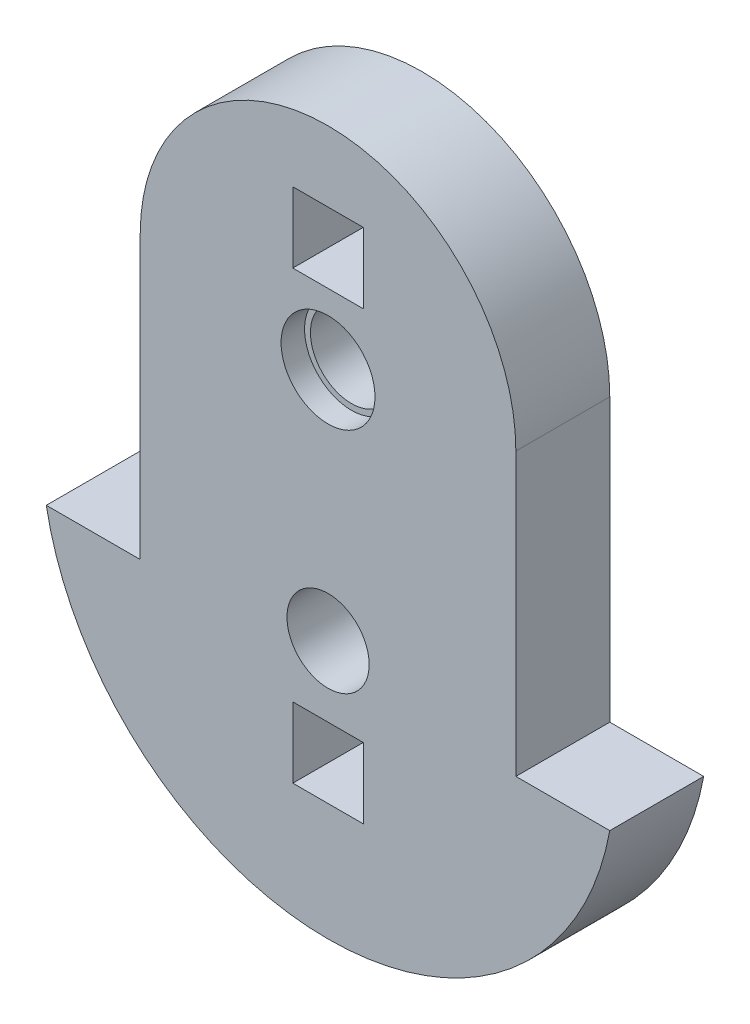
ISO-10303-21;
HEADER;
FILE_DESCRIPTION(('STEP AP214'),'2;1');
FILE_NAME('part.step','',(''),(''),'','','');
FILE_SCHEMA(('AUTOMOTIVE_DESIGN { 1 0 10303 214 1 1 1 1 }'));
ENDSEC;
DATA;
#1=APPLICATION_CONTEXT('core data for automotive mechanical design processes');
#2=APPLICATION_PROTOCOL_DEFINITION('international standard','automotive_design',2000,#1);
#3=PRODUCT_CONTEXT('',#1,'mechanical');
#4=PRODUCT('Part','Part','',(#3));
#5=PRODUCT_RELATED_PRODUCT_CATEGORY('part','',(#4));
#6=PRODUCT_DEFINITION_FORMATION('','',#4);
#7=PRODUCT_DEFINITION_CONTEXT('part definition',#1,'design');
#8=PRODUCT_DEFINITION('design','',#6,#7);
#9=PRODUCT_DEFINITION_SHAPE('','',#8);
#10=(LENGTH_UNIT() NAMED_UNIT(*) SI_UNIT(.MILLI.,.METRE.));
#11=(NAMED_UNIT(*) PLANE_ANGLE_UNIT() SI_UNIT($,.RADIAN.));
#12=(NAMED_UNIT(*) SI_UNIT($,.STERADIAN.) SOLID_ANGLE_UNIT());
#13=UNCERTAINTY_MEASURE_WITH_UNIT(LENGTH_MEASURE(1.E-05),#10,'distance_accuracy_value','');
#14=(GEOMETRIC_REPRESENTATION_CONTEXT(3) GLOBAL_UNCERTAINTY_ASSIGNED_CONTEXT((#13)) GLOBAL_UNIT_ASSIGNED_CONTEXT((#10,
#11,#12)) REPRESENTATION_CONTEXT('',''));
#15=CARTESIAN_POINT('',(0.,0.,0.));
#16=DIRECTION('',(0.,0.,1.));
#17=DIRECTION('',(1.,0.,0.));
#18=AXIS2_PLACEMENT_3D('',#15,#16,#17);
#19=CARTESIAN_POINT('',(0.,5.,4.));
#20=DIRECTION('',(0.,0.,-1.));
#21=DIRECTION('',(-1.,0.,0.));
#22=AXIS2_PLACEMENT_3D('',#19,#20,#21);
#23=CYLINDRICAL_SURFACE('',#22,1.75);
#24=CARTESIAN_POINT('',(0.,5.,0.));
#25=DIRECTION('',(0.,0.,1.));
#26=DIRECTION('',(1.,0.,0.));
#27=AXIS2_PLACEMENT_3D('',#24,#25,#26);
#28=CIRCLE('',#27,1.75);
#29=CARTESIAN_POINT('',(1.75,5.,0.));
#30=VERTEX_POINT('',#29);
#31=EDGE_CURVE('E217',#30,#30,#28,.T.);
#32=ORIENTED_EDGE('',*,*,#31,.F.);
#33=EDGE_LOOP('',(#32));
#34=FACE_BOUND('',#33,.T.);
#35=CARTESIAN_POINT('',(0.,5.,3.));
#36=DIRECTION('',(0.,0.,1.));
#37=DIRECTION('',(1.,0.,0.));
#38=AXIS2_PLACEMENT_3D('',#35,#36,#37);
#39=CIRCLE('',#38,1.75);
#40=CARTESIAN_POINT('',(1.75,5.,3.));
#41=VERTEX_POINT('',#40);
#42=EDGE_CURVE('E43',#41,#41,#39,.T.);
#43=ORIENTED_EDGE('',*,*,#42,.T.);
#44=EDGE_LOOP('',(#43));
#45=FACE_BOUND('',#44,.T.);
#46=ADVANCED_FACE('F39',(#34,#45),#23,.F.);
#47=CARTESIAN_POINT('',(0.,6.,4.));
#48=DIRECTION('',(0.,0.,-1.));
#49=DIRECTION('',(-1.,0.,0.));
#50=AXIS2_PLACEMENT_3D('',#47,#48,#49);
#51=PLANE('',#50);
#52=CARTESIAN_POINT('',(0.,5.,4.));
#53=DIRECTION('',(0.,0.,1.));
#54=DIRECTION('',(1.,0.,0.));
#55=AXIS2_PLACEMENT_3D('',#52,#53,#54);
#56=CIRCLE('',#55,2.);
#57=CARTESIAN_POINT('',(2.,5.,4.));
#58=VERTEX_POINT('',#57);
#59=EDGE_CURVE('E168',#58,#58,#56,.T.);
#60=ORIENTED_EDGE('',*,*,#59,.F.);
#61=EDGE_LOOP('',(#60));
#62=FACE_BOUND('',#61,.T.);
#63=DIRECTION('',(-1.,0.,0.));
#64=VECTOR('',#63,1.);
#65=CARTESIAN_POINT('',(-1.5,11.,4.));
#66=LINE('',#65,#64);
#67=CARTESIAN_POINT('',(1.5,11.,4.));
#68=VERTEX_POINT('',#67);
#69=CARTESIAN_POINT('',(-1.5,11.,4.));
#70=VERTEX_POINT('',#69);
#71=EDGE_CURVE('E174',#68,#70,#66,.T.);
#72=ORIENTED_EDGE('',*,*,#71,.F.);
#73=DIRECTION('',(0.,1.,0.));
#74=VECTOR('',#73,1.);
#75=CARTESIAN_POINT('',(1.5,8.,4.));
#76=LINE('',#75,#74);
#77=CARTESIAN_POINT('',(1.5,8.,4.));
#78=VERTEX_POINT('',#77);
#79=EDGE_CURVE('E55',#78,#68,#76,.T.);
#80=ORIENTED_EDGE('',*,*,#79,.F.);
#81=DIRECTION('',(1.,0.,0.));
#82=VECTOR('',#81,1.);
#83=CARTESIAN_POINT('',(-1.5,8.,4.));
#84=LINE('',#83,#82);
#85=CARTESIAN_POINT('',(-1.5,8.,4.));
#86=VERTEX_POINT('',#85);
#87=EDGE_CURVE('E162',#86,#78,#84,.T.);
#88=ORIENTED_EDGE('',*,*,#87,.F.);
#89=DIRECTION('',(0.,-1.,0.));
#90=VECTOR('',#89,1.);
#91=CARTESIAN_POINT('',(-1.5,8.,4.));
#92=LINE('',#91,#90);
#93=EDGE_CURVE('E165',#70,#86,#92,.T.);
#94=ORIENTED_EDGE('',*,*,#93,.F.);
#95=EDGE_LOOP('',(#72,#80,#88,#94));
#96=FACE_BOUND('',#95,.T.);
#97=DIRECTION('',(-1.,0.,0.));
#98=VECTOR('',#97,1.);
#99=CARTESIAN_POINT('',(-1.5,-8.,4.));
#100=LINE('',#99,#98);
#101=CARTESIAN_POINT('',(1.5,-8.,4.));
#102=VERTEX_POINT('',#101);
#103=CARTESIAN_POINT('',(-1.5,-8.,4.));
#104=VERTEX_POINT('',#103);
#105=EDGE_CURVE('E200',#102,#104,#100,.T.);
#106=ORIENTED_EDGE('',*,*,#105,.F.);
#107=DIRECTION('',(0.,1.,0.));
#108=VECTOR('',#107,1.);
#109=CARTESIAN_POINT('',(1.5,-11.,4.));
#110=LINE('',#109,#108);
#111=CARTESIAN_POINT('',(1.5,-11.,4.));
#112=VERTEX_POINT('',#111);
#113=EDGE_CURVE('E63',#112,#102,#110,.T.);
#114=ORIENTED_EDGE('',*,*,#113,.F.);
#115=DIRECTION('',(1.,0.,0.));
#116=VECTOR('',#115,1.);
#117=CARTESIAN_POINT('',(-1.5,-11.,4.));
#118=LINE('',#117,#116);
#119=CARTESIAN_POINT('',(-1.5,-11.,4.));
#120=VERTEX_POINT('',#119);
#121=EDGE_CURVE('E193',#120,#112,#118,.T.);
#122=ORIENTED_EDGE('',*,*,#121,.F.);
#123=DIRECTION('',(0.,-1.,0.));
#124=VECTOR('',#123,1.);
#125=CARTESIAN_POINT('',(-1.5,-11.,4.));
#126=LINE('',#125,#124);
#127=EDGE_CURVE('E196',#104,#120,#126,.T.);
#128=ORIENTED_EDGE('',*,*,#127,.F.);
#129=EDGE_LOOP('',(#106,#114,#122,#128));
#130=FACE_BOUND('',#129,.T.);
#131=CARTESIAN_POINT('',(0.,6.,4.));
#132=DIRECTION('',(0.,0.,1.));
#133=DIRECTION('',(-1.,0.,0.));
#134=AXIS2_PLACEMENT_3D('',#131,#132,#133);
#135=CIRCLE('',#134,8.);
#136=CARTESIAN_POINT('',(8.,6.,4.));
#137=VERTEX_POINT('',#136);
#138=CARTESIAN_POINT('',(-8.,6.,4.));
#139=VERTEX_POINT('',#138);
#140=EDGE_CURVE('E223',#137,#139,#135,.T.);
#141=ORIENTED_EDGE('',*,*,#140,.T.);
#142=DIRECTION('',(0.,-1.,0.));
#143=VECTOR('',#142,1.);
#144=CARTESIAN_POINT('',(-8.,6.,4.));
#145=LINE('',#144,#143);
#146=CARTESIAN_POINT('',(-8.,-6.,4.));
#147=VERTEX_POINT('',#146);
#148=EDGE_CURVE('E226',#139,#147,#145,.T.);
#149=ORIENTED_EDGE('',*,*,#148,.T.);
#150=DIRECTION('',(-1.,0.,0.));
#151=VECTOR('',#150,1.);
#152=CARTESIAN_POINT('',(-8.,-6.,4.));
#153=LINE('',#152,#151);
#154=CARTESIAN_POINT('',(-12.,-6.,4.));
#155=VERTEX_POINT('',#154);
#156=EDGE_CURVE('E229',#147,#155,#153,.T.);
#157=ORIENTED_EDGE('',*,*,#156,.T.);
#158=CARTESIAN_POINT('',(0.,-3.8,4.));
#159=DIRECTION('',(0.,0.,1.));
#160=DIRECTION('',(1.,0.,0.));
#161=AXIS2_PLACEMENT_3D('',#158,#159,#160);
#162=CIRCLE('',#161,12.2);
#163=CARTESIAN_POINT('',(12.,-6.,4.));
#164=VERTEX_POINT('',#163);
#165=EDGE_CURVE('E231',#155,#164,#162,.T.);
#166=ORIENTED_EDGE('',*,*,#165,.T.);
#167=DIRECTION('',(-1.,0.,0.));
#168=VECTOR('',#167,1.);
#169=CARTESIAN_POINT('',(8.,-6.,4.));
#170=LINE('',#169,#168);
#171=CARTESIAN_POINT('',(8.,-6.,4.));
#172=VERTEX_POINT('',#171);
#173=EDGE_CURVE('E233',#164,#172,#170,.T.);
#174=ORIENTED_EDGE('',*,*,#173,.T.);
#175=DIRECTION('',(0.,1.,0.));
#176=VECTOR('',#175,1.);
#177=CARTESIAN_POINT('',(8.,6.,4.));
#178=LINE('',#177,#176);
#179=EDGE_CURVE('E235',#172,#137,#178,.T.);
#180=ORIENTED_EDGE('',*,*,#179,.T.);
#181=EDGE_LOOP('',(#141,#149,#157,#166,#174,#180));
#182=FACE_BOUND('',#181,.T.);
#183=CARTESIAN_POINT('',(0.,-5.,4.));
#184=DIRECTION('',(0.,0.,1.));
#185=DIRECTION('',(1.,0.,0.));
#186=AXIS2_PLACEMENT_3D('',#183,#184,#185);
#187=CIRCLE('',#186,1.75);
#188=CARTESIAN_POINT('',(1.75,-5.,4.));
#189=VERTEX_POINT('',#188);
#190=EDGE_CURVE('E214',#189,#189,#187,.T.);
#191=ORIENTED_EDGE('',*,*,#190,.F.);
#192=EDGE_LOOP('',(#191));
#193=FACE_BOUND('',#192,.T.);
#194=ADVANCED_FACE('F284',(#62,#96,#130,#182,#193),#51,.F.);
#195=CARTESIAN_POINT('',(0.,6.,0.));
#196=DIRECTION('',(0.,0.,-1.));
#197=DIRECTION('',(-1.,0.,0.));
#198=AXIS2_PLACEMENT_3D('',#195,#196,#197);
#199=PLANE('',#198);
#200=DIRECTION('',(0.,1.,0.));
#201=VECTOR('',#200,1.);
#202=CARTESIAN_POINT('',(1.5,8.,0.));
#203=LINE('',#202,#201);
#204=CARTESIAN_POINT('',(1.5,8.,0.));
#205=VERTEX_POINT('',#204);
#206=CARTESIAN_POINT('',(1.5,11.,0.));
#207=VERTEX_POINT('',#206);
#208=EDGE_CURVE('E143',#205,#207,#203,.T.);
#209=ORIENTED_EDGE('',*,*,#208,.T.);
#210=DIRECTION('',(-1.,0.,0.));
#211=VECTOR('',#210,1.);
#212=CARTESIAN_POINT('',(-1.5,11.,0.));
#213=LINE('',#212,#211);
#214=CARTESIAN_POINT('',(-1.5,11.,0.));
#215=VERTEX_POINT('',#214);
#216=EDGE_CURVE('E153',#207,#215,#213,.T.);
#217=ORIENTED_EDGE('',*,*,#216,.T.);
#218=DIRECTION('',(0.,-1.,0.));
#219=VECTOR('',#218,1.);
#220=CARTESIAN_POINT('',(-1.5,8.,0.));
#221=LINE('',#220,#219);
#222=CARTESIAN_POINT('',(-1.5,8.,0.));
#223=VERTEX_POINT('',#222);
#224=EDGE_CURVE('E157',#215,#223,#221,.T.);
#225=ORIENTED_EDGE('',*,*,#224,.T.);
#226=DIRECTION('',(1.,0.,0.));
#227=VECTOR('',#226,1.);
#228=CARTESIAN_POINT('',(-1.5,8.,0.));
#229=LINE('',#228,#227);
#230=EDGE_CURVE('E149',#223,#205,#229,.T.);
#231=ORIENTED_EDGE('',*,*,#230,.T.);
#232=EDGE_LOOP('',(#209,#217,#225,#231));
#233=FACE_BOUND('',#232,.T.);
#234=DIRECTION('',(0.,1.,0.));
#235=VECTOR('',#234,1.);
#236=CARTESIAN_POINT('',(1.5,-11.,0.));
#237=LINE('',#236,#235);
#238=CARTESIAN_POINT('',(1.5,-11.,0.));
#239=VERTEX_POINT('',#238);
#240=CARTESIAN_POINT('',(1.5,-8.,0.));
#241=VERTEX_POINT('',#240);
#242=EDGE_CURVE('E197',#239,#241,#237,.T.);
#243=ORIENTED_EDGE('',*,*,#242,.T.);
#244=DIRECTION('',(-1.,0.,0.));
#245=VECTOR('',#244,1.);
#246=CARTESIAN_POINT('',(-1.5,-8.,0.));
#247=LINE('',#246,#245);
#248=CARTESIAN_POINT('',(-1.5,-8.,0.));
#249=VERTEX_POINT('',#248);
#250=EDGE_CURVE('E209',#241,#249,#247,.T.);
#251=ORIENTED_EDGE('',*,*,#250,.T.);
#252=DIRECTION('',(0.,-1.,0.));
#253=VECTOR('',#252,1.);
#254=CARTESIAN_POINT('',(-1.5,-11.,0.));
#255=LINE('',#254,#253);
#256=CARTESIAN_POINT('',(-1.5,-11.,0.));
#257=VERTEX_POINT('',#256);
#258=EDGE_CURVE('E206',#249,#257,#255,.T.);
#259=ORIENTED_EDGE('',*,*,#258,.T.);
#260=DIRECTION('',(1.,0.,0.));
#261=VECTOR('',#260,1.);
#262=CARTESIAN_POINT('',(-1.5,-11.,0.));
#263=LINE('',#262,#261);
#264=EDGE_CURVE('E186',#257,#239,#263,.T.);
#265=ORIENTED_EDGE('',*,*,#264,.T.);
#266=EDGE_LOOP('',(#243,#251,#259,#265));
#267=FACE_BOUND('',#266,.T.);
#268=ORIENTED_EDGE('',*,*,#31,.T.);
#269=EDGE_LOOP('',(#268));
#270=FACE_BOUND('',#269,.T.);
#271=CARTESIAN_POINT('',(0.,6.,0.));
#272=DIRECTION('',(0.,0.,1.));
#273=DIRECTION('',(-1.,0.,0.));
#274=AXIS2_PLACEMENT_3D('',#271,#272,#273);
#275=CIRCLE('',#274,8.);
#276=CARTESIAN_POINT('',(8.,6.,0.));
#277=VERTEX_POINT('',#276);
#278=CARTESIAN_POINT('',(-8.,6.,0.));
#279=VERTEX_POINT('',#278);
#280=EDGE_CURVE('E222',#277,#279,#275,.T.);
#281=ORIENTED_EDGE('',*,*,#280,.F.);
#282=DIRECTION('',(0.,1.,0.));
#283=VECTOR('',#282,1.);
#284=CARTESIAN_POINT('',(8.,6.,0.));
#285=LINE('',#284,#283);
#286=CARTESIAN_POINT('',(8.,-6.,0.));
#287=VERTEX_POINT('',#286);
#288=EDGE_CURVE('E227',#287,#277,#285,.T.);
#289=ORIENTED_EDGE('',*,*,#288,.F.);
#290=DIRECTION('',(-1.,0.,0.));
#291=VECTOR('',#290,1.);
#292=CARTESIAN_POINT('',(8.,-6.,0.));
#293=LINE('',#292,#291);
#294=CARTESIAN_POINT('',(12.,-6.,0.));
#295=VERTEX_POINT('',#294);
#296=EDGE_CURVE('E246',#295,#287,#293,.T.);
#297=ORIENTED_EDGE('',*,*,#296,.F.);
#298=CARTESIAN_POINT('',(0.,-3.8,0.));
#299=DIRECTION('',(0.,0.,1.));
#300=DIRECTION('',(1.,0.,0.));
#301=AXIS2_PLACEMENT_3D('',#298,#299,#300);
#302=CIRCLE('',#301,12.2);
#303=CARTESIAN_POINT('',(-12.,-6.,0.));
#304=VERTEX_POINT('',#303);
#305=EDGE_CURVE('E244',#304,#295,#302,.T.);
#306=ORIENTED_EDGE('',*,*,#305,.F.);
#307=DIRECTION('',(-1.,0.,0.));
#308=VECTOR('',#307,1.);
#309=CARTESIAN_POINT('',(-8.,-6.,0.));
#310=LINE('',#309,#308);
#311=CARTESIAN_POINT('',(-8.,-6.,0.));
#312=VERTEX_POINT('',#311);
#313=EDGE_CURVE('E242',#312,#304,#310,.T.);
#314=ORIENTED_EDGE('',*,*,#313,.F.);
#315=DIRECTION('',(0.,-1.,0.));
#316=VECTOR('',#315,1.);
#317=CARTESIAN_POINT('',(-8.,6.,0.));
#318=LINE('',#317,#316);
#319=EDGE_CURVE('E240',#279,#312,#318,.T.);
#320=ORIENTED_EDGE('',*,*,#319,.F.);
#321=EDGE_LOOP('',(#281,#289,#297,#306,#314,#320));
#322=FACE_BOUND('',#321,.T.);
#323=CARTESIAN_POINT('',(0.,-5.,0.));
#324=DIRECTION('',(0.,0.,1.));
#325=DIRECTION('',(1.,0.,0.));
#326=AXIS2_PLACEMENT_3D('',#323,#324,#325);
#327=CIRCLE('',#326,1.75);
#328=CARTESIAN_POINT('',(1.75,-5.,0.));
#329=VERTEX_POINT('',#328);
#330=EDGE_CURVE('E180',#329,#329,#327,.T.);
#331=ORIENTED_EDGE('',*,*,#330,.T.);
#332=EDGE_LOOP('',(#331));
#333=FACE_BOUND('',#332,.T.);
#334=ADVANCED_FACE('F159',(#233,#267,#270,#322,#333),#199,.T.);
#335=CARTESIAN_POINT('',(0.,6.,4.));
#336=DIRECTION('',(0.,0.,-1.));
#337=DIRECTION('',(-1.,0.,0.));
#338=AXIS2_PLACEMENT_3D('',#335,#336,#337);
#339=CYLINDRICAL_SURFACE('',#338,8.);
#340=ORIENTED_EDGE('',*,*,#280,.T.);
#341=DIRECTION('',(0.,0.,-1.));
#342=VECTOR('',#341,1.);
#343=CARTESIAN_POINT('',(-8.,6.,4.));
#344=LINE('',#343,#342);
#345=EDGE_CURVE('E11',#139,#279,#344,.T.);
#346=ORIENTED_EDGE('',*,*,#345,.F.);
#347=ORIENTED_EDGE('',*,*,#140,.F.);
#348=DIRECTION('',(0.,0.,-1.));
#349=VECTOR('',#348,1.);
#350=CARTESIAN_POINT('',(8.,6.,4.));
#351=LINE('',#350,#349);
#352=EDGE_CURVE('E237',#137,#277,#351,.T.);
#353=ORIENTED_EDGE('',*,*,#352,.T.);
#354=EDGE_LOOP('',(#340,#346,#347,#353));
#355=FACE_BOUND('',#354,.T.);
#356=ADVANCED_FACE('F41',(#355),#339,.T.);
#357=CARTESIAN_POINT('',(-8.,6.,4.));
#358=DIRECTION('',(1.,0.,0.));
#359=DIRECTION('',(0.,0.,-1.));
#360=AXIS2_PLACEMENT_3D('',#357,#358,#359);
#361=PLANE('',#360);
#362=ORIENTED_EDGE('',*,*,#319,.T.);
#363=DIRECTION('',(0.,0.,-1.));
#364=VECTOR('',#363,1.);
#365=CARTESIAN_POINT('',(-8.,-6.,4.));
#366=LINE('',#365,#364);
#367=EDGE_CURVE('E48',#147,#312,#366,.T.);
#368=ORIENTED_EDGE('',*,*,#367,.F.);
#369=ORIENTED_EDGE('',*,*,#148,.F.);
#370=ORIENTED_EDGE('',*,*,#345,.T.);
#371=EDGE_LOOP('',(#362,#368,#369,#370));
#372=FACE_BOUND('',#371,.T.);
#373=ADVANCED_FACE('F289',(#372),#361,.F.);
#374=CARTESIAN_POINT('',(-8.,-6.,4.));
#375=DIRECTION('',(0.,-1.,0.));
#376=DIRECTION('',(1.,0.,0.));
#377=AXIS2_PLACEMENT_3D('',#374,#375,#376);
#378=PLANE('',#377);
#379=ORIENTED_EDGE('',*,*,#313,.T.);
#380=DIRECTION('',(0.,0.,-1.));
#381=VECTOR('',#380,1.);
#382=CARTESIAN_POINT('',(-12.,-6.,4.));
#383=LINE('',#382,#381);
#384=EDGE_CURVE('E257',#155,#304,#383,.T.);
#385=ORIENTED_EDGE('',*,*,#384,.F.);
#386=ORIENTED_EDGE('',*,*,#156,.F.);
#387=ORIENTED_EDGE('',*,*,#367,.T.);
#388=EDGE_LOOP('',(#379,#385,#386,#387));
#389=FACE_BOUND('',#388,.T.);
#390=ADVANCED_FACE('F265',(#389),#378,.F.);
#391=CARTESIAN_POINT('',(0.,-3.8,4.));
#392=DIRECTION('',(0.,0.,-1.));
#393=DIRECTION('',(-1.,0.,0.));
#394=AXIS2_PLACEMENT_3D('',#391,#392,#393);
#395=CYLINDRICAL_SURFACE('',#394,12.2);
#396=ORIENTED_EDGE('',*,*,#305,.T.);
#397=DIRECTION('',(0.,0.,-1.));
#398=VECTOR('',#397,1.);
#399=CARTESIAN_POINT('',(12.,-6.,4.));
#400=LINE('',#399,#398);
#401=EDGE_CURVE('E254',#164,#295,#400,.T.);
#402=ORIENTED_EDGE('',*,*,#401,.F.);
#403=ORIENTED_EDGE('',*,*,#165,.F.);
#404=ORIENTED_EDGE('',*,*,#384,.T.);
#405=EDGE_LOOP('',(#396,#402,#403,#404));
#406=FACE_BOUND('',#405,.T.);
#407=ADVANCED_FACE('F276',(#406),#395,.T.);
#408=CARTESIAN_POINT('',(8.,-6.,4.));
#409=DIRECTION('',(0.,-1.,0.));
#410=DIRECTION('',(1.,0.,0.));
#411=AXIS2_PLACEMENT_3D('',#408,#409,#410);
#412=PLANE('',#411);
#413=ORIENTED_EDGE('',*,*,#296,.T.);
#414=DIRECTION('',(0.,0.,-1.));
#415=VECTOR('',#414,1.);
#416=CARTESIAN_POINT('',(8.,-6.,4.));
#417=LINE('',#416,#415);
#418=EDGE_CURVE('E251',#172,#287,#417,.T.);
#419=ORIENTED_EDGE('',*,*,#418,.F.);
#420=ORIENTED_EDGE('',*,*,#173,.F.);
#421=ORIENTED_EDGE('',*,*,#401,.T.);
#422=EDGE_LOOP('',(#413,#419,#420,#421));
#423=FACE_BOUND('',#422,.T.);
#424=ADVANCED_FACE('F280',(#423),#412,.F.);
#425=CARTESIAN_POINT('',(8.,6.,4.));
#426=DIRECTION('',(-1.,0.,0.));
#427=DIRECTION('',(0.,0.,1.));
#428=AXIS2_PLACEMENT_3D('',#425,#426,#427);
#429=PLANE('',#428);
#430=ORIENTED_EDGE('',*,*,#288,.T.);
#431=ORIENTED_EDGE('',*,*,#352,.F.);
#432=ORIENTED_EDGE('',*,*,#179,.F.);
#433=ORIENTED_EDGE('',*,*,#418,.T.);
#434=EDGE_LOOP('',(#430,#431,#432,#433));
#435=FACE_BOUND('',#434,.T.);
#436=ADVANCED_FACE('F292',(#435),#429,.F.);
#437=CARTESIAN_POINT('',(0.,-5.,4.));
#438=DIRECTION('',(0.,0.,-1.));
#439=DIRECTION('',(-1.,0.,0.));
#440=AXIS2_PLACEMENT_3D('',#437,#438,#439);
#441=CYLINDRICAL_SURFACE('',#440,1.75);
#442=ORIENTED_EDGE('',*,*,#190,.T.);
#443=EDGE_LOOP('',(#442));
#444=FACE_BOUND('',#443,.T.);
#445=ORIENTED_EDGE('',*,*,#330,.F.);
#446=EDGE_LOOP('',(#445));
#447=FACE_BOUND('',#446,.T.);
#448=ADVANCED_FACE('F294',(#444,#447),#441,.F.);
#449=CARTESIAN_POINT('',(1.5,-11.,0.));
#450=DIRECTION('',(1.,0.,0.));
#451=DIRECTION('',(0.,0.,-1.));
#452=AXIS2_PLACEMENT_3D('',#449,#450,#451);
#453=PLANE('',#452);
#454=ORIENTED_EDGE('',*,*,#113,.T.);
#455=DIRECTION('',(0.,0.,1.));
#456=VECTOR('',#455,1.);
#457=CARTESIAN_POINT('',(1.5,-8.,0.));
#458=LINE('',#457,#456);
#459=EDGE_CURVE('E184',#241,#102,#458,.T.);
#460=ORIENTED_EDGE('',*,*,#459,.F.);
#461=ORIENTED_EDGE('',*,*,#242,.F.);
#462=DIRECTION('',(0.,0.,1.));
#463=VECTOR('',#462,1.);
#464=CARTESIAN_POINT('',(1.5,-11.,0.));
#465=LINE('',#464,#463);
#466=EDGE_CURVE('E191',#239,#112,#465,.T.);
#467=ORIENTED_EDGE('',*,*,#466,.T.);
#468=EDGE_LOOP('',(#454,#460,#461,#467));
#469=FACE_BOUND('',#468,.T.);
#470=ADVANCED_FACE('F300',(#469),#453,.F.);
#471=CARTESIAN_POINT('',(-1.5,-11.,0.));
#472=DIRECTION('',(0.,-1.,0.));
#473=DIRECTION('',(0.,0.,-1.));
#474=AXIS2_PLACEMENT_3D('',#471,#472,#473);
#475=PLANE('',#474);
#476=ORIENTED_EDGE('',*,*,#121,.T.);
#477=ORIENTED_EDGE('',*,*,#466,.F.);
#478=ORIENTED_EDGE('',*,*,#264,.F.);
#479=DIRECTION('',(0.,0.,1.));
#480=VECTOR('',#479,1.);
#481=CARTESIAN_POINT('',(-1.5,-11.,0.));
#482=LINE('',#481,#480);
#483=EDGE_CURVE('E189',#257,#120,#482,.T.);
#484=ORIENTED_EDGE('',*,*,#483,.T.);
#485=EDGE_LOOP('',(#476,#477,#478,#484));
#486=FACE_BOUND('',#485,.T.);
#487=ADVANCED_FACE('F359',(#486),#475,.F.);
#488=CARTESIAN_POINT('',(-1.5,-11.,0.));
#489=DIRECTION('',(-1.,0.,0.));
#490=DIRECTION('',(0.,0.,1.));
#491=AXIS2_PLACEMENT_3D('',#488,#489,#490);
#492=PLANE('',#491);
#493=ORIENTED_EDGE('',*,*,#127,.T.);
#494=ORIENTED_EDGE('',*,*,#483,.F.);
#495=ORIENTED_EDGE('',*,*,#258,.F.);
#496=DIRECTION('',(0.,0.,1.));
#497=VECTOR('',#496,1.);
#498=CARTESIAN_POINT('',(-1.5,-8.,0.));
#499=LINE('',#498,#497);
#500=EDGE_CURVE('E187',#249,#104,#499,.T.);
#501=ORIENTED_EDGE('',*,*,#500,.T.);
#502=EDGE_LOOP('',(#493,#494,#495,#501));
#503=FACE_BOUND('',#502,.T.);
#504=ADVANCED_FACE('F368',(#503),#492,.F.);
#505=CARTESIAN_POINT('',(-1.5,-8.,0.));
#506=DIRECTION('',(0.,1.,0.));
#507=DIRECTION('',(0.,0.,1.));
#508=AXIS2_PLACEMENT_3D('',#505,#506,#507);
#509=PLANE('',#508);
#510=ORIENTED_EDGE('',*,*,#105,.T.);
#511=ORIENTED_EDGE('',*,*,#500,.F.);
#512=ORIENTED_EDGE('',*,*,#250,.F.);
#513=ORIENTED_EDGE('',*,*,#459,.T.);
#514=EDGE_LOOP('',(#510,#511,#512,#513));
#515=FACE_BOUND('',#514,.T.);
#516=ADVANCED_FACE('F377',(#515),#509,.F.);
#517=CARTESIAN_POINT('',(1.5,8.,0.));
#518=DIRECTION('',(1.,0.,0.));
#519=DIRECTION('',(0.,0.,-1.));
#520=AXIS2_PLACEMENT_3D('',#517,#518,#519);
#521=PLANE('',#520);
#522=ORIENTED_EDGE('',*,*,#79,.T.);
#523=DIRECTION('',(0.,0.,1.));
#524=VECTOR('',#523,1.);
#525=CARTESIAN_POINT('',(1.5,11.,0.));
#526=LINE('',#525,#524);
#527=EDGE_CURVE('E139',#207,#68,#526,.T.);
#528=ORIENTED_EDGE('',*,*,#527,.F.);
#529=ORIENTED_EDGE('',*,*,#208,.F.);
#530=DIRECTION('',(0.,0.,1.));
#531=VECTOR('',#530,1.);
#532=CARTESIAN_POINT('',(1.5,8.,0.));
#533=LINE('',#532,#531);
#534=EDGE_CURVE('E178',#205,#78,#533,.T.);
#535=ORIENTED_EDGE('',*,*,#534,.T.);
#536=EDGE_LOOP('',(#522,#528,#529,#535));
#537=FACE_BOUND('',#536,.T.);
#538=ADVANCED_FACE('F141',(#537),#521,.F.);
#539=CARTESIAN_POINT('',(-1.5,8.,0.));
#540=DIRECTION('',(0.,-1.,0.));
#541=DIRECTION('',(0.,0.,-1.));
#542=AXIS2_PLACEMENT_3D('',#539,#540,#541);
#543=PLANE('',#542);
#544=ORIENTED_EDGE('',*,*,#87,.T.);
#545=ORIENTED_EDGE('',*,*,#534,.F.);
#546=ORIENTED_EDGE('',*,*,#230,.F.);
#547=DIRECTION('',(0.,0.,1.));
#548=VECTOR('',#547,1.);
#549=CARTESIAN_POINT('',(-1.5,8.,0.));
#550=LINE('',#549,#548);
#551=EDGE_CURVE('E181',#223,#86,#550,.T.);
#552=ORIENTED_EDGE('',*,*,#551,.T.);
#553=EDGE_LOOP('',(#544,#545,#546,#552));
#554=FACE_BOUND('',#553,.T.);
#555=ADVANCED_FACE('F396',(#554),#543,.F.);
#556=CARTESIAN_POINT('',(-1.5,8.,0.));
#557=DIRECTION('',(-1.,0.,0.));
#558=DIRECTION('',(0.,0.,1.));
#559=AXIS2_PLACEMENT_3D('',#556,#557,#558);
#560=PLANE('',#559);
#561=ORIENTED_EDGE('',*,*,#93,.T.);
#562=ORIENTED_EDGE('',*,*,#551,.F.);
#563=ORIENTED_EDGE('',*,*,#224,.F.);
#564=DIRECTION('',(0.,0.,1.));
#565=VECTOR('',#564,1.);
#566=CARTESIAN_POINT('',(-1.5,11.,0.));
#567=LINE('',#566,#565);
#568=EDGE_CURVE('E148',#215,#70,#567,.T.);
#569=ORIENTED_EDGE('',*,*,#568,.T.);
#570=EDGE_LOOP('',(#561,#562,#563,#569));
#571=FACE_BOUND('',#570,.T.);
#572=ADVANCED_FACE('F405',(#571),#560,.F.);
#573=CARTESIAN_POINT('',(-1.5,11.,0.));
#574=DIRECTION('',(0.,1.,0.));
#575=DIRECTION('',(0.,0.,1.));
#576=AXIS2_PLACEMENT_3D('',#573,#574,#575);
#577=PLANE('',#576);
#578=ORIENTED_EDGE('',*,*,#71,.T.);
#579=ORIENTED_EDGE('',*,*,#568,.F.);
#580=ORIENTED_EDGE('',*,*,#216,.F.);
#581=ORIENTED_EDGE('',*,*,#527,.T.);
#582=EDGE_LOOP('',(#578,#579,#580,#581));
#583=FACE_BOUND('',#582,.T.);
#584=ADVANCED_FACE('F154',(#583),#577,.F.);
#585=CARTESIAN_POINT('',(0.,5.,3.));
#586=DIRECTION('',(0.,0.,1.));
#587=DIRECTION('',(1.,0.,0.));
#588=AXIS2_PLACEMENT_3D('',#585,#586,#587);
#589=CYLINDRICAL_SURFACE('',#588,2.);
#590=CARTESIAN_POINT('',(0.,5.,3.));
#591=DIRECTION('',(0.,0.,1.));
#592=DIRECTION('',(1.,0.,0.));
#593=AXIS2_PLACEMENT_3D('',#590,#591,#592);
#594=CIRCLE('',#593,2.);
#595=CARTESIAN_POINT('',(2.,5.,3.));
#596=VERTEX_POINT('',#595);
#597=EDGE_CURVE('E454',#596,#596,#594,.T.);
#598=ORIENTED_EDGE('',*,*,#597,.F.);
#599=EDGE_LOOP('',(#598));
#600=FACE_BOUND('',#599,.T.);
#601=ORIENTED_EDGE('',*,*,#59,.T.);
#602=EDGE_LOOP('',(#601));
#603=FACE_BOUND('',#602,.T.);
#604=ADVANCED_FACE('F423',(#600,#603),#589,.F.);
#605=CARTESIAN_POINT('',(0.,5.,3.));
#606=DIRECTION('',(0.,0.,1.));
#607=DIRECTION('',(1.,0.,0.));
#608=AXIS2_PLACEMENT_3D('',#605,#606,#607);
#609=PLANE('',#608);
#610=ORIENTED_EDGE('',*,*,#42,.F.);
#611=EDGE_LOOP('',(#610));
#612=FACE_BOUND('',#611,.T.);
#613=ORIENTED_EDGE('',*,*,#597,.T.);
#614=EDGE_LOOP('',(#613));
#615=FACE_BOUND('',#614,.T.);
#616=ADVANCED_FACE('F436',(#612,#615),#609,.T.);
#617=CLOSED_SHELL('',(#46,#194,#334,#356,#373,#390,#407,#424,#436,#448,#470,#487,#504,#516,#538,
#555,#572,#584,#604,#616));
#618=MANIFOLD_SOLID_BREP('B2',#617);
#619=ADVANCED_BREP_SHAPE_REPRESENTATION('',(#18,#618),#14);
#620=SHAPE_DEFINITION_REPRESENTATION(#9,#619);
ENDSEC;
END-ISO-10303-21;
